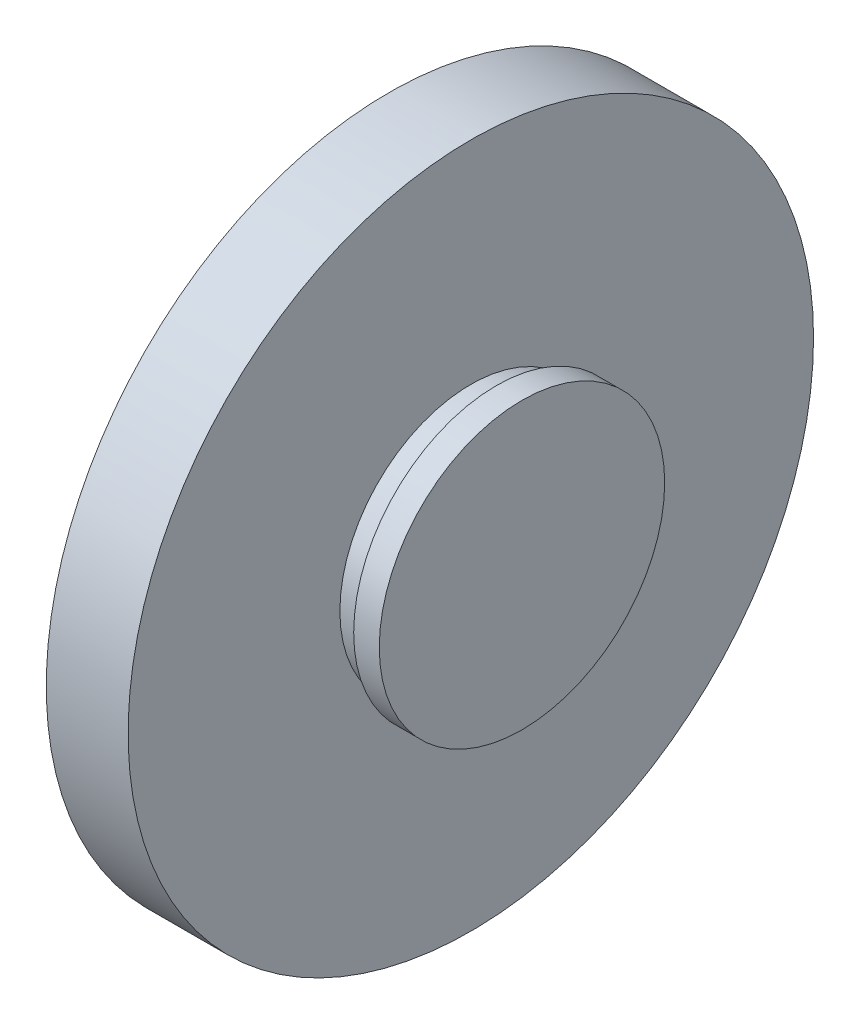
ISO-10303-21;
HEADER;
FILE_DESCRIPTION(('STEP AP214'),'2;1');
FILE_NAME('part.step','',(''),(''),'','','');
FILE_SCHEMA(('AUTOMOTIVE_DESIGN { 1 0 10303 214 1 1 1 1 }'));
ENDSEC;
DATA;
#1=APPLICATION_CONTEXT('core data for automotive mechanical design processes');
#2=APPLICATION_PROTOCOL_DEFINITION('international standard','automotive_design',2000,#1);
#3=PRODUCT_CONTEXT('',#1,'mechanical');
#4=PRODUCT('Part','Part','',(#3));
#5=PRODUCT_RELATED_PRODUCT_CATEGORY('part','',(#4));
#6=PRODUCT_DEFINITION_FORMATION('','',#4);
#7=PRODUCT_DEFINITION_CONTEXT('part definition',#1,'design');
#8=PRODUCT_DEFINITION('design','',#6,#7);
#9=PRODUCT_DEFINITION_SHAPE('','',#8);
#10=(LENGTH_UNIT() NAMED_UNIT(*) SI_UNIT(.MILLI.,.METRE.));
#11=(NAMED_UNIT(*) PLANE_ANGLE_UNIT() SI_UNIT($,.RADIAN.));
#12=(NAMED_UNIT(*) SI_UNIT($,.STERADIAN.) SOLID_ANGLE_UNIT());
#13=UNCERTAINTY_MEASURE_WITH_UNIT(LENGTH_MEASURE(1.E-05),#10,'distance_accuracy_value','');
#14=(GEOMETRIC_REPRESENTATION_CONTEXT(3) GLOBAL_UNCERTAINTY_ASSIGNED_CONTEXT((#13)) GLOBAL_UNIT_ASSIGNED_CONTEXT((#10,
#11,#12)) REPRESENTATION_CONTEXT('',''));
#15=CARTESIAN_POINT('',(0.,0.,0.));
#16=DIRECTION('',(0.,0.,1.));
#17=DIRECTION('',(1.,0.,0.));
#18=AXIS2_PLACEMENT_3D('',#15,#16,#17);
#19=CARTESIAN_POINT('',(8.,0.,0.));
#20=DIRECTION('',(-1.,0.,0.));
#21=DIRECTION('',(0.,0.,1.));
#22=AXIS2_PLACEMENT_3D('',#19,#20,#21);
#23=CYLINDRICAL_SURFACE('',#22,33.5);
#24=CARTESIAN_POINT('',(8.,0.,0.));
#25=DIRECTION('',(1.,0.,0.));
#26=DIRECTION('',(0.,0.,-1.));
#27=AXIS2_PLACEMENT_3D('',#24,#25,#26);
#28=CIRCLE('',#27,33.5);
#29=CARTESIAN_POINT('',(8.,0.,-33.5));
#30=VERTEX_POINT('',#29);
#31=EDGE_CURVE('E45',#30,#30,#28,.T.);
#32=ORIENTED_EDGE('',*,*,#31,.F.);
#33=EDGE_LOOP('',(#32));
#34=FACE_BOUND('',#33,.T.);
#35=CARTESIAN_POINT('',(0.,0.,0.));
#36=DIRECTION('',(1.,0.,0.));
#37=DIRECTION('',(0.,0.,-1.));
#38=AXIS2_PLACEMENT_3D('',#35,#36,#37);
#39=CIRCLE('',#38,33.5);
#40=CARTESIAN_POINT('',(0.,0.,-33.5));
#41=VERTEX_POINT('',#40);
#42=EDGE_CURVE('E40',#41,#41,#39,.T.);
#43=ORIENTED_EDGE('',*,*,#42,.T.);
#44=EDGE_LOOP('',(#43));
#45=FACE_BOUND('',#44,.T.);
#46=ADVANCED_FACE('F37',(#34,#45),#23,.T.);
#47=CARTESIAN_POINT('',(8.,0.,0.));
#48=DIRECTION('',(1.,0.,0.));
#49=DIRECTION('',(0.,0.,-1.));
#50=AXIS2_PLACEMENT_3D('',#47,#48,#49);
#51=PLANE('',#50);
#52=CARTESIAN_POINT('',(8.,0.,0.));
#53=DIRECTION('',(1.,0.,0.));
#54=DIRECTION('',(0.,0.,-1.));
#55=AXIS2_PLACEMENT_3D('',#52,#53,#54);
#56=CIRCLE('',#55,12.8);
#57=CARTESIAN_POINT('',(8.,0.,-12.8));
#58=VERTEX_POINT('',#57);
#59=EDGE_CURVE('E11',#58,#58,#56,.T.);
#60=ORIENTED_EDGE('',*,*,#59,.F.);
#61=EDGE_LOOP('',(#60));
#62=FACE_BOUND('',#61,.T.);
#63=ORIENTED_EDGE('',*,*,#31,.T.);
#64=EDGE_LOOP('',(#63));
#65=FACE_BOUND('',#64,.T.);
#66=ADVANCED_FACE('F230',(#62,#65),#51,.T.);
#67=CARTESIAN_POINT('',(0.,0.,0.));
#68=DIRECTION('',(1.,0.,0.));
#69=DIRECTION('',(0.,0.,-1.));
#70=AXIS2_PLACEMENT_3D('',#67,#68,#69);
#71=PLANE('',#70);
#72=DIRECTION('',(0.,-0.119879149923698,0.992788491781392));
#73=VECTOR('',#72,1.);
#74=CARTESIAN_POINT('',(0.,-6.5,-6.5));
#75=LINE('',#74,#73);
#76=CARTESIAN_POINT('',(0.,-4.00000000000001,-27.2039441890706));
#77=VERTEX_POINT('',#76);
#78=CARTESIAN_POINT('',(0.,-6.5,-6.5));
#79=VERTEX_POINT('',#78);
#80=EDGE_CURVE('E163',#77,#79,#75,.T.);
#81=ORIENTED_EDGE('',*,*,#80,.F.);
#82=CARTESIAN_POINT('',(0.,0.,-26.7209444326629));
#83=DIRECTION('',(-1.,0.,0.));
#84=DIRECTION('',(0.,0.,1.));
#85=AXIS2_PLACEMENT_3D('',#82,#83,#84);
#86=CIRCLE('',#85,4.02905556733709);
#87=CARTESIAN_POINT('',(0.,4.00000000000002,-27.2039441890706));
#88=VERTEX_POINT('',#87);
#89=EDGE_CURVE('E53',#88,#77,#86,.T.);
#90=ORIENTED_EDGE('',*,*,#89,.F.);
#91=DIRECTION('',(0.,-0.119879149923698,-0.992788491781392));
#92=VECTOR('',#91,1.);
#93=CARTESIAN_POINT('',(0.,4.00000000000002,-27.2039441890706));
#94=LINE('',#93,#92);
#95=CARTESIAN_POINT('',(0.,6.5,-6.5));
#96=VERTEX_POINT('',#95);
#97=EDGE_CURVE('E191',#96,#88,#94,.T.);
#98=ORIENTED_EDGE('',*,*,#97,.F.);
#99=DIRECTION('',(0.,-0.992788491781392,-0.119879149923698));
#100=VECTOR('',#99,1.);
#101=CARTESIAN_POINT('',(0.,6.5,-6.5));
#102=LINE('',#101,#100);
#103=CARTESIAN_POINT('',(0.,27.2039441890706,-4.));
#104=VERTEX_POINT('',#103);
#105=EDGE_CURVE('E189',#104,#96,#102,.T.);
#106=ORIENTED_EDGE('',*,*,#105,.F.);
#107=CARTESIAN_POINT('',(0.,26.7209444326629,0.));
#108=DIRECTION('',(-1.,0.,0.));
#109=DIRECTION('',(0.,0.,-1.));
#110=AXIS2_PLACEMENT_3D('',#107,#108,#109);
#111=CIRCLE('',#110,4.02905556733708);
#112=CARTESIAN_POINT('',(0.,27.2039441890706,4.));
#113=VERTEX_POINT('',#112);
#114=EDGE_CURVE('E137',#113,#104,#111,.T.);
#115=ORIENTED_EDGE('',*,*,#114,.F.);
#116=DIRECTION('',(0.,0.992788491781392,-0.119879149923698));
#117=VECTOR('',#116,1.);
#118=CARTESIAN_POINT('',(0.,27.2039441890706,4.));
#119=LINE('',#118,#117);
#120=CARTESIAN_POINT('',(0.,6.5,6.5));
#121=VERTEX_POINT('',#120);
#122=EDGE_CURVE('E185',#121,#113,#119,.T.);
#123=ORIENTED_EDGE('',*,*,#122,.F.);
#124=DIRECTION('',(0.,0.119879149923698,-0.992788491781392));
#125=VECTOR('',#124,1.);
#126=CARTESIAN_POINT('',(0.,6.5,6.5));
#127=LINE('',#126,#125);
#128=CARTESIAN_POINT('',(0.,4.00000000000002,27.2039441890706));
#129=VERTEX_POINT('',#128);
#130=EDGE_CURVE('E182',#129,#121,#127,.T.);
#131=ORIENTED_EDGE('',*,*,#130,.F.);
#132=CARTESIAN_POINT('',(0.,0.,26.7209444326629));
#133=DIRECTION('',(-1.,0.,0.));
#134=DIRECTION('',(0.,0.,-1.));
#135=AXIS2_PLACEMENT_3D('',#132,#133,#134);
#136=CIRCLE('',#135,4.02905556733709);
#137=CARTESIAN_POINT('',(0.,-4.00000000000002,27.2039441890706));
#138=VERTEX_POINT('',#137);
#139=EDGE_CURVE('E179',#138,#129,#136,.T.);
#140=ORIENTED_EDGE('',*,*,#139,.F.);
#141=DIRECTION('',(0.,0.119879149923698,0.992788491781392));
#142=VECTOR('',#141,1.);
#143=CARTESIAN_POINT('',(0.,-4.00000000000002,27.2039441890706));
#144=LINE('',#143,#142);
#145=CARTESIAN_POINT('',(0.,-6.5,6.5));
#146=VERTEX_POINT('',#145);
#147=EDGE_CURVE('E176',#146,#138,#144,.T.);
#148=ORIENTED_EDGE('',*,*,#147,.F.);
#149=DIRECTION('',(0.,0.992788491781392,0.119879149923698));
#150=VECTOR('',#149,1.);
#151=CARTESIAN_POINT('',(0.,-6.5,6.5));
#152=LINE('',#151,#150);
#153=CARTESIAN_POINT('',(0.,-27.2039441890706,4.));
#154=VERTEX_POINT('',#153);
#155=EDGE_CURVE('E173',#154,#146,#152,.T.);
#156=ORIENTED_EDGE('',*,*,#155,.F.);
#157=CARTESIAN_POINT('',(0.,-26.7209444326629,0.));
#158=DIRECTION('',(-1.,0.,0.));
#159=DIRECTION('',(0.,0.,-1.));
#160=AXIS2_PLACEMENT_3D('',#157,#158,#159);
#161=CIRCLE('',#160,4.02905556733708);
#162=CARTESIAN_POINT('',(0.,-27.2039441890706,-4.));
#163=VERTEX_POINT('',#162);
#164=EDGE_CURVE('E170',#163,#154,#161,.T.);
#165=ORIENTED_EDGE('',*,*,#164,.F.);
#166=DIRECTION('',(0.,-0.992788491781392,0.119879149923698));
#167=VECTOR('',#166,1.);
#168=CARTESIAN_POINT('',(0.,-27.2039441890706,-4.));
#169=LINE('',#168,#167);
#170=EDGE_CURVE('E167',#79,#163,#169,.T.);
#171=ORIENTED_EDGE('',*,*,#170,.F.);
#172=EDGE_LOOP('',(#81,#90,#98,#106,#115,#123,#131,#140,#148,#156,#165,#171));
#173=FACE_BOUND('',#172,.T.);
#174=ORIENTED_EDGE('',*,*,#42,.F.);
#175=EDGE_LOOP('',(#174));
#176=FACE_BOUND('',#175,.T.);
#177=ADVANCED_FACE('F227',(#173,#176),#71,.F.);
#178=CARTESIAN_POINT('',(10.5,0.,0.));
#179=DIRECTION('',(-1.,0.,0.));
#180=DIRECTION('',(0.,0.,1.));
#181=AXIS2_PLACEMENT_3D('',#178,#179,#180);
#182=CYLINDRICAL_SURFACE('',#181,12.8);
#183=CARTESIAN_POINT('',(10.5,0.,0.));
#184=DIRECTION('',(1.,0.,0.));
#185=DIRECTION('',(0.,0.,-1.));
#186=AXIS2_PLACEMENT_3D('',#183,#184,#185);
#187=CIRCLE('',#186,12.8);
#188=CARTESIAN_POINT('',(10.5,0.,-12.8));
#189=VERTEX_POINT('',#188);
#190=EDGE_CURVE('E216',#189,#189,#187,.T.);
#191=ORIENTED_EDGE('',*,*,#190,.F.);
#192=EDGE_LOOP('',(#191));
#193=FACE_BOUND('',#192,.T.);
#194=ORIENTED_EDGE('',*,*,#59,.T.);
#195=EDGE_LOOP('',(#194));
#196=FACE_BOUND('',#195,.T.);
#197=ADVANCED_FACE('F229',(#193,#196),#182,.T.);
#198=CARTESIAN_POINT('',(13.,0.,0.));
#199=DIRECTION('',(-1.,0.,0.));
#200=DIRECTION('',(0.,0.,1.));
#201=AXIS2_PLACEMENT_3D('',#198,#199,#200);
#202=CYLINDRICAL_SURFACE('',#201,13.95);
#203=CARTESIAN_POINT('',(13.,0.,0.));
#204=DIRECTION('',(1.,0.,0.));
#205=DIRECTION('',(0.,0.,-1.));
#206=AXIS2_PLACEMENT_3D('',#203,#204,#205);
#207=CIRCLE('',#206,13.95);
#208=CARTESIAN_POINT('',(13.,0.,-13.95));
#209=VERTEX_POINT('',#208);
#210=EDGE_CURVE('E213',#209,#209,#207,.T.);
#211=ORIENTED_EDGE('',*,*,#210,.F.);
#212=EDGE_LOOP('',(#211));
#213=FACE_BOUND('',#212,.T.);
#214=CARTESIAN_POINT('',(10.5,0.,0.));
#215=DIRECTION('',(1.,0.,0.));
#216=DIRECTION('',(0.,0.,-1.));
#217=AXIS2_PLACEMENT_3D('',#214,#215,#216);
#218=CIRCLE('',#217,13.95);
#219=CARTESIAN_POINT('',(10.5,0.,-13.95));
#220=VERTEX_POINT('',#219);
#221=EDGE_CURVE('E195',#220,#220,#218,.T.);
#222=ORIENTED_EDGE('',*,*,#221,.T.);
#223=EDGE_LOOP('',(#222));
#224=FACE_BOUND('',#223,.T.);
#225=ADVANCED_FACE('F236',(#213,#224),#202,.T.);
#226=CARTESIAN_POINT('',(13.,0.,0.));
#227=DIRECTION('',(1.,0.,0.));
#228=DIRECTION('',(0.,0.,-1.));
#229=AXIS2_PLACEMENT_3D('',#226,#227,#228);
#230=PLANE('',#229);
#231=ORIENTED_EDGE('',*,*,#210,.T.);
#232=EDGE_LOOP('',(#231));
#233=FACE_BOUND('',#232,.T.);
#234=ADVANCED_FACE('F266',(#233),#230,.T.);
#235=CARTESIAN_POINT('',(10.5,0.,0.));
#236=DIRECTION('',(1.,0.,0.));
#237=DIRECTION('',(0.,0.,-1.));
#238=AXIS2_PLACEMENT_3D('',#235,#236,#237);
#239=PLANE('',#238);
#240=ORIENTED_EDGE('',*,*,#190,.T.);
#241=EDGE_LOOP('',(#240));
#242=FACE_BOUND('',#241,.T.);
#243=ORIENTED_EDGE('',*,*,#221,.F.);
#244=EDGE_LOOP('',(#243));
#245=FACE_BOUND('',#244,.T.);
#246=ADVANCED_FACE('F276',(#242,#245),#239,.F.);
#247=CARTESIAN_POINT('',(5.5,0.,-26.7209444326629));
#248=DIRECTION('',(-1.,0.,0.));
#249=DIRECTION('',(0.,0.,1.));
#250=AXIS2_PLACEMENT_3D('',#247,#248,#249);
#251=CYLINDRICAL_SURFACE('',#250,4.02905556733709);
#252=ORIENTED_EDGE('',*,*,#89,.T.);
#253=DIRECTION('',(-1.,0.,0.));
#254=VECTOR('',#253,1.);
#255=CARTESIAN_POINT('',(5.5,-4.00000000000002,-27.2039441890706));
#256=LINE('',#255,#254);
#257=CARTESIAN_POINT('',(5.5,-4.00000000000002,-27.2039441890706));
#258=VERTEX_POINT('',#257);
#259=EDGE_CURVE('E101',#258,#77,#256,.T.);
#260=ORIENTED_EDGE('',*,*,#259,.F.);
#261=CARTESIAN_POINT('',(5.5,0.,-26.7209444326629));
#262=DIRECTION('',(-1.,0.,0.));
#263=DIRECTION('',(0.,0.,1.));
#264=AXIS2_PLACEMENT_3D('',#261,#262,#263);
#265=CIRCLE('',#264,4.02905556733709);
#266=CARTESIAN_POINT('',(5.5,4.00000000000002,-27.2039441890706));
#267=VERTEX_POINT('',#266);
#268=EDGE_CURVE('E193',#267,#258,#265,.T.);
#269=ORIENTED_EDGE('',*,*,#268,.F.);
#270=DIRECTION('',(-1.,0.,0.));
#271=VECTOR('',#270,1.);
#272=CARTESIAN_POINT('',(5.5,4.00000000000002,-27.2039441890706));
#273=LINE('',#272,#271);
#274=EDGE_CURVE('E61',#267,#88,#273,.T.);
#275=ORIENTED_EDGE('',*,*,#274,.T.);
#276=EDGE_LOOP('',(#252,#260,#269,#275));
#277=FACE_BOUND('',#276,.T.);
#278=ADVANCED_FACE('F285',(#277),#251,.F.);
#279=CARTESIAN_POINT('',(5.5,4.00000000000002,-27.2039441890706));
#280=DIRECTION('',(0.,0.992788491781392,-0.119879149923698));
#281=DIRECTION('',(0.,0.119879149923698,0.992788491781392));
#282=AXIS2_PLACEMENT_3D('',#279,#280,#281);
#283=PLANE('',#282);
#284=ORIENTED_EDGE('',*,*,#97,.T.);
#285=ORIENTED_EDGE('',*,*,#274,.F.);
#286=DIRECTION('',(0.,-0.119879149923698,-0.992788491781392));
#287=VECTOR('',#286,1.);
#288=CARTESIAN_POINT('',(5.5,4.00000000000002,-27.2039441890706));
#289=LINE('',#288,#287);
#290=CARTESIAN_POINT('',(5.5,6.5,-6.5));
#291=VERTEX_POINT('',#290);
#292=EDGE_CURVE('E149',#291,#267,#289,.T.);
#293=ORIENTED_EDGE('',*,*,#292,.F.);
#294=DIRECTION('',(-1.,0.,0.));
#295=VECTOR('',#294,1.);
#296=CARTESIAN_POINT('',(5.5,6.5,-6.5));
#297=LINE('',#296,#295);
#298=EDGE_CURVE('E141',#291,#96,#297,.T.);
#299=ORIENTED_EDGE('',*,*,#298,.T.);
#300=EDGE_LOOP('',(#284,#285,#293,#299));
#301=FACE_BOUND('',#300,.T.);
#302=ADVANCED_FACE('F299',(#301),#283,.F.);
#303=CARTESIAN_POINT('',(5.5,6.5,-6.5));
#304=DIRECTION('',(0.,0.119879149923698,-0.992788491781392));
#305=DIRECTION('',(0.,0.992788491781392,0.119879149923698));
#306=AXIS2_PLACEMENT_3D('',#303,#304,#305);
#307=PLANE('',#306);
#308=ORIENTED_EDGE('',*,*,#105,.T.);
#309=ORIENTED_EDGE('',*,*,#298,.F.);
#310=DIRECTION('',(0.,-0.992788491781392,-0.119879149923698));
#311=VECTOR('',#310,1.);
#312=CARTESIAN_POINT('',(5.5,6.5,-6.5));
#313=LINE('',#312,#311);
#314=CARTESIAN_POINT('',(5.5,27.2039441890706,-4.));
#315=VERTEX_POINT('',#314);
#316=EDGE_CURVE('E145',#315,#291,#313,.T.);
#317=ORIENTED_EDGE('',*,*,#316,.F.);
#318=DIRECTION('',(-1.,0.,0.));
#319=VECTOR('',#318,1.);
#320=CARTESIAN_POINT('',(5.5,27.2039441890706,-4.));
#321=LINE('',#320,#319);
#322=EDGE_CURVE('E130',#315,#104,#321,.T.);
#323=ORIENTED_EDGE('',*,*,#322,.T.);
#324=EDGE_LOOP('',(#308,#309,#317,#323));
#325=FACE_BOUND('',#324,.T.);
#326=ADVANCED_FACE('F146',(#325),#307,.F.);
#327=CARTESIAN_POINT('',(5.5,26.7209444326629,0.));
#328=DIRECTION('',(-1.,0.,0.));
#329=DIRECTION('',(0.,0.,1.));
#330=AXIS2_PLACEMENT_3D('',#327,#328,#329);
#331=CYLINDRICAL_SURFACE('',#330,4.02905556733708);
#332=ORIENTED_EDGE('',*,*,#114,.T.);
#333=ORIENTED_EDGE('',*,*,#322,.F.);
#334=CARTESIAN_POINT('',(5.5,26.7209444326629,0.));
#335=DIRECTION('',(-1.,0.,0.));
#336=DIRECTION('',(0.,0.,-1.));
#337=AXIS2_PLACEMENT_3D('',#334,#335,#336);
#338=CIRCLE('',#337,4.02905556733708);
#339=CARTESIAN_POINT('',(5.5,27.2039441890706,4.));
#340=VERTEX_POINT('',#339);
#341=EDGE_CURVE('E134',#340,#315,#338,.T.);
#342=ORIENTED_EDGE('',*,*,#341,.F.);
#343=DIRECTION('',(-1.,0.,0.));
#344=VECTOR('',#343,1.);
#345=CARTESIAN_POINT('',(5.5,27.2039441890706,4.));
#346=LINE('',#345,#344);
#347=EDGE_CURVE('E142',#340,#113,#346,.T.);
#348=ORIENTED_EDGE('',*,*,#347,.T.);
#349=EDGE_LOOP('',(#332,#333,#342,#348));
#350=FACE_BOUND('',#349,.T.);
#351=ADVANCED_FACE('F132',(#350),#331,.F.);
#352=CARTESIAN_POINT('',(5.5,27.2039441890706,4.));
#353=DIRECTION('',(0.,0.119879149923698,0.992788491781392));
#354=DIRECTION('',(0.,-0.992788491781392,0.119879149923698));
#355=AXIS2_PLACEMENT_3D('',#352,#353,#354);
#356=PLANE('',#355);
#357=ORIENTED_EDGE('',*,*,#122,.T.);
#358=ORIENTED_EDGE('',*,*,#347,.F.);
#359=DIRECTION('',(0.,0.992788491781392,-0.119879149923698));
#360=VECTOR('',#359,1.);
#361=CARTESIAN_POINT('',(5.5,27.2039441890706,4.));
#362=LINE('',#361,#360);
#363=CARTESIAN_POINT('',(5.5,6.5,6.5));
#364=VERTEX_POINT('',#363);
#365=EDGE_CURVE('E155',#364,#340,#362,.T.);
#366=ORIENTED_EDGE('',*,*,#365,.F.);
#367=DIRECTION('',(-1.,0.,0.));
#368=VECTOR('',#367,1.);
#369=CARTESIAN_POINT('',(5.5,6.5,6.5));
#370=LINE('',#369,#368);
#371=EDGE_CURVE('E198',#364,#121,#370,.T.);
#372=ORIENTED_EDGE('',*,*,#371,.T.);
#373=EDGE_LOOP('',(#357,#358,#366,#372));
#374=FACE_BOUND('',#373,.T.);
#375=ADVANCED_FACE('F324',(#374),#356,.F.);
#376=CARTESIAN_POINT('',(5.5,6.5,6.5));
#377=DIRECTION('',(0.,0.992788491781392,0.119879149923698));
#378=DIRECTION('',(0.,-0.119879149923698,0.992788491781392));
#379=AXIS2_PLACEMENT_3D('',#376,#377,#378);
#380=PLANE('',#379);
#381=ORIENTED_EDGE('',*,*,#130,.T.);
#382=ORIENTED_EDGE('',*,*,#371,.F.);
#383=DIRECTION('',(0.,0.119879149923698,-0.992788491781392));
#384=VECTOR('',#383,1.);
#385=CARTESIAN_POINT('',(5.5,6.5,6.5));
#386=LINE('',#385,#384);
#387=CARTESIAN_POINT('',(5.5,4.00000000000002,27.2039441890706));
#388=VERTEX_POINT('',#387);
#389=EDGE_CURVE('E157',#388,#364,#386,.T.);
#390=ORIENTED_EDGE('',*,*,#389,.F.);
#391=DIRECTION('',(-1.,0.,0.));
#392=VECTOR('',#391,1.);
#393=CARTESIAN_POINT('',(5.5,4.00000000000002,27.2039441890706));
#394=LINE('',#393,#392);
#395=EDGE_CURVE('E200',#388,#129,#394,.T.);
#396=ORIENTED_EDGE('',*,*,#395,.T.);
#397=EDGE_LOOP('',(#381,#382,#390,#396));
#398=FACE_BOUND('',#397,.T.);
#399=ADVANCED_FACE('F333',(#398),#380,.F.);
#400=CARTESIAN_POINT('',(5.5,0.,26.7209444326629));
#401=DIRECTION('',(-1.,0.,0.));
#402=DIRECTION('',(0.,0.,1.));
#403=AXIS2_PLACEMENT_3D('',#400,#401,#402);
#404=CYLINDRICAL_SURFACE('',#403,4.02905556733709);
#405=ORIENTED_EDGE('',*,*,#139,.T.);
#406=ORIENTED_EDGE('',*,*,#395,.F.);
#407=CARTESIAN_POINT('',(5.5,0.,26.7209444326629));
#408=DIRECTION('',(-1.,0.,0.));
#409=DIRECTION('',(0.,0.,-1.));
#410=AXIS2_PLACEMENT_3D('',#407,#408,#409);
#411=CIRCLE('',#410,4.02905556733709);
#412=CARTESIAN_POINT('',(5.5,-4.00000000000002,27.2039441890706));
#413=VERTEX_POINT('',#412);
#414=EDGE_CURVE('E459',#413,#388,#411,.T.);
#415=ORIENTED_EDGE('',*,*,#414,.F.);
#416=DIRECTION('',(-1.,0.,0.));
#417=VECTOR('',#416,1.);
#418=CARTESIAN_POINT('',(5.5,-4.00000000000002,27.2039441890706));
#419=LINE('',#418,#417);
#420=EDGE_CURVE('E202',#413,#138,#419,.T.);
#421=ORIENTED_EDGE('',*,*,#420,.T.);
#422=EDGE_LOOP('',(#405,#406,#415,#421));
#423=FACE_BOUND('',#422,.T.);
#424=ADVANCED_FACE('F343',(#423),#404,.F.);
#425=CARTESIAN_POINT('',(5.5,-4.00000000000002,27.2039441890706));
#426=DIRECTION('',(0.,-0.992788491781392,0.119879149923698));
#427=DIRECTION('',(0.,-0.119879149923698,-0.992788491781392));
#428=AXIS2_PLACEMENT_3D('',#425,#426,#427);
#429=PLANE('',#428);
#430=ORIENTED_EDGE('',*,*,#147,.T.);
#431=ORIENTED_EDGE('',*,*,#420,.F.);
#432=DIRECTION('',(0.,0.119879149923698,0.992788491781392));
#433=VECTOR('',#432,1.);
#434=CARTESIAN_POINT('',(5.5,-4.00000000000002,27.2039441890706));
#435=LINE('',#434,#433);
#436=CARTESIAN_POINT('',(5.5,-6.5,6.5));
#437=VERTEX_POINT('',#436);
#438=EDGE_CURVE('E456',#437,#413,#435,.T.);
#439=ORIENTED_EDGE('',*,*,#438,.F.);
#440=DIRECTION('',(-1.,0.,0.));
#441=VECTOR('',#440,1.);
#442=CARTESIAN_POINT('',(5.5,-6.5,6.5));
#443=LINE('',#442,#441);
#444=EDGE_CURVE('E204',#437,#146,#443,.T.);
#445=ORIENTED_EDGE('',*,*,#444,.T.);
#446=EDGE_LOOP('',(#430,#431,#439,#445));
#447=FACE_BOUND('',#446,.T.);
#448=ADVANCED_FACE('F353',(#447),#429,.F.);
#449=CARTESIAN_POINT('',(5.5,-6.5,6.5));
#450=DIRECTION('',(0.,-0.119879149923698,0.992788491781392));
#451=DIRECTION('',(0.,-0.992788491781392,-0.119879149923698));
#452=AXIS2_PLACEMENT_3D('',#449,#450,#451);
#453=PLANE('',#452);
#454=ORIENTED_EDGE('',*,*,#155,.T.);
#455=ORIENTED_EDGE('',*,*,#444,.F.);
#456=DIRECTION('',(0.,0.992788491781392,0.119879149923698));
#457=VECTOR('',#456,1.);
#458=CARTESIAN_POINT('',(5.5,-6.5,6.5));
#459=LINE('',#458,#457);
#460=CARTESIAN_POINT('',(5.5,-27.2039441890706,4.));
#461=VERTEX_POINT('',#460);
#462=EDGE_CURVE('E453',#461,#437,#459,.T.);
#463=ORIENTED_EDGE('',*,*,#462,.F.);
#464=DIRECTION('',(-1.,0.,0.));
#465=VECTOR('',#464,1.);
#466=CARTESIAN_POINT('',(5.5,-27.2039441890706,4.));
#467=LINE('',#466,#465);
#468=EDGE_CURVE('E206',#461,#154,#467,.T.);
#469=ORIENTED_EDGE('',*,*,#468,.T.);
#470=EDGE_LOOP('',(#454,#455,#463,#469));
#471=FACE_BOUND('',#470,.T.);
#472=ADVANCED_FACE('F363',(#471),#453,.F.);
#473=CARTESIAN_POINT('',(5.5,-26.7209444326629,0.));
#474=DIRECTION('',(-1.,0.,0.));
#475=DIRECTION('',(0.,0.,1.));
#476=AXIS2_PLACEMENT_3D('',#473,#474,#475);
#477=CYLINDRICAL_SURFACE('',#476,4.02905556733708);
#478=ORIENTED_EDGE('',*,*,#164,.T.);
#479=ORIENTED_EDGE('',*,*,#468,.F.);
#480=CARTESIAN_POINT('',(5.5,-26.7209444326629,0.));
#481=DIRECTION('',(-1.,0.,0.));
#482=DIRECTION('',(0.,0.,-1.));
#483=AXIS2_PLACEMENT_3D('',#480,#481,#482);
#484=CIRCLE('',#483,4.02905556733708);
#485=CARTESIAN_POINT('',(5.5,-27.2039441890706,-4.));
#486=VERTEX_POINT('',#485);
#487=EDGE_CURVE('E450',#486,#461,#484,.T.);
#488=ORIENTED_EDGE('',*,*,#487,.F.);
#489=DIRECTION('',(-1.,0.,0.));
#490=VECTOR('',#489,1.);
#491=CARTESIAN_POINT('',(5.5,-27.2039441890706,-4.));
#492=LINE('',#491,#490);
#493=EDGE_CURVE('E208',#486,#163,#492,.T.);
#494=ORIENTED_EDGE('',*,*,#493,.T.);
#495=EDGE_LOOP('',(#478,#479,#488,#494));
#496=FACE_BOUND('',#495,.T.);
#497=ADVANCED_FACE('F373',(#496),#477,.F.);
#498=CARTESIAN_POINT('',(5.5,-27.2039441890706,-4.));
#499=DIRECTION('',(0.,-0.119879149923698,-0.992788491781392));
#500=DIRECTION('',(0.,0.992788491781392,-0.119879149923698));
#501=AXIS2_PLACEMENT_3D('',#498,#499,#500);
#502=PLANE('',#501);
#503=ORIENTED_EDGE('',*,*,#170,.T.);
#504=ORIENTED_EDGE('',*,*,#493,.F.);
#505=DIRECTION('',(0.,-0.992788491781392,0.119879149923698));
#506=VECTOR('',#505,1.);
#507=CARTESIAN_POINT('',(5.5,-27.2039441890706,-4.));
#508=LINE('',#507,#506);
#509=CARTESIAN_POINT('',(5.5,-6.5,-6.5));
#510=VERTEX_POINT('',#509);
#511=EDGE_CURVE('E447',#510,#486,#508,.T.);
#512=ORIENTED_EDGE('',*,*,#511,.F.);
#513=DIRECTION('',(-1.,0.,0.));
#514=VECTOR('',#513,1.);
#515=CARTESIAN_POINT('',(5.5,-6.5,-6.5));
#516=LINE('',#515,#514);
#517=EDGE_CURVE('E210',#510,#79,#516,.T.);
#518=ORIENTED_EDGE('',*,*,#517,.T.);
#519=EDGE_LOOP('',(#503,#504,#512,#518));
#520=FACE_BOUND('',#519,.T.);
#521=ADVANCED_FACE('F383',(#520),#502,.F.);
#522=CARTESIAN_POINT('',(5.5,-6.5,-6.5));
#523=DIRECTION('',(0.,-0.992788491781392,-0.119879149923698));
#524=DIRECTION('',(0.,0.119879149923698,-0.992788491781392));
#525=AXIS2_PLACEMENT_3D('',#522,#523,#524);
#526=PLANE('',#525);
#527=ORIENTED_EDGE('',*,*,#80,.T.);
#528=ORIENTED_EDGE('',*,*,#517,.F.);
#529=DIRECTION('',(0.,-0.119879149923698,0.992788491781392));
#530=VECTOR('',#529,1.);
#531=CARTESIAN_POINT('',(5.5,-6.5,-6.5));
#532=LINE('',#531,#530);
#533=EDGE_CURVE('E444',#258,#510,#532,.T.);
#534=ORIENTED_EDGE('',*,*,#533,.F.);
#535=ORIENTED_EDGE('',*,*,#259,.T.);
#536=EDGE_LOOP('',(#527,#528,#534,#535));
#537=FACE_BOUND('',#536,.T.);
#538=ADVANCED_FACE('F393',(#537),#526,.F.);
#539=CARTESIAN_POINT('',(5.5,0.,-26.7209444326629));
#540=DIRECTION('',(-1.,0.,0.));
#541=DIRECTION('',(0.,0.,1.));
#542=AXIS2_PLACEMENT_3D('',#539,#540,#541);
#543=PLANE('',#542);
#544=CARTESIAN_POINT('',(5.5,0.,0.));
#545=DIRECTION('',(-1.,0.,0.));
#546=DIRECTION('',(0.,0.,1.));
#547=AXIS2_PLACEMENT_3D('',#544,#545,#546);
#548=CIRCLE('',#547,6.);
#549=CARTESIAN_POINT('',(5.5,0.,6.));
#550=VERTEX_POINT('',#549);
#551=EDGE_CURVE('E438',#550,#550,#548,.T.);
#552=ORIENTED_EDGE('',*,*,#551,.F.);
#553=EDGE_LOOP('',(#552));
#554=FACE_BOUND('',#553,.T.);
#555=ORIENTED_EDGE('',*,*,#268,.T.);
#556=ORIENTED_EDGE('',*,*,#533,.T.);
#557=ORIENTED_EDGE('',*,*,#511,.T.);
#558=ORIENTED_EDGE('',*,*,#487,.T.);
#559=ORIENTED_EDGE('',*,*,#462,.T.);
#560=ORIENTED_EDGE('',*,*,#438,.T.);
#561=ORIENTED_EDGE('',*,*,#414,.T.);
#562=ORIENTED_EDGE('',*,*,#389,.T.);
#563=ORIENTED_EDGE('',*,*,#365,.T.);
#564=ORIENTED_EDGE('',*,*,#341,.T.);
#565=ORIENTED_EDGE('',*,*,#316,.T.);
#566=ORIENTED_EDGE('',*,*,#292,.T.);
#567=EDGE_LOOP('',(#555,#556,#557,#558,#559,#560,#561,#562,#563,#564,#565,#566));
#568=FACE_BOUND('',#567,.T.);
#569=ADVANCED_FACE('F152',(#554,#568),#543,.T.);
#570=CARTESIAN_POINT('',(8.7,0.,0.));
#571=DIRECTION('',(-1.,0.,0.));
#572=DIRECTION('',(0.,0.,1.));
#573=AXIS2_PLACEMENT_3D('',#570,#571,#572);
#574=CYLINDRICAL_SURFACE('',#573,6.);
#575=CARTESIAN_POINT('',(8.7,0.,0.));
#576=DIRECTION('',(-1.,0.,0.));
#577=DIRECTION('',(0.,0.,1.));
#578=AXIS2_PLACEMENT_3D('',#575,#576,#577);
#579=CIRCLE('',#578,6.);
#580=CARTESIAN_POINT('',(8.7,0.,6.));
#581=VERTEX_POINT('',#580);
#582=EDGE_CURVE('E164',#581,#581,#579,.T.);
#583=ORIENTED_EDGE('',*,*,#582,.F.);
#584=EDGE_LOOP('',(#583));
#585=FACE_BOUND('',#584,.T.);
#586=ORIENTED_EDGE('',*,*,#551,.T.);
#587=EDGE_LOOP('',(#586));
#588=FACE_BOUND('',#587,.T.);
#589=ADVANCED_FACE('F412',(#585,#588),#574,.F.);
#590=CARTESIAN_POINT('',(8.7,0.,0.));
#591=DIRECTION('',(-1.,0.,0.));
#592=DIRECTION('',(0.,0.,1.));
#593=AXIS2_PLACEMENT_3D('',#590,#591,#592);
#594=PLANE('',#593);
#595=ORIENTED_EDGE('',*,*,#582,.T.);
#596=EDGE_LOOP('',(#595));
#597=FACE_BOUND('',#596,.T.);
#598=ADVANCED_FACE('F422',(#597),#594,.T.);
#599=CLOSED_SHELL('',(#46,#66,#177,#197,#225,#234,#246,#278,#302,#326,#351,#375,#399,#424,#448,
#472,#497,#521,#538,#569,#589,#598));
#600=MANIFOLD_SOLID_BREP('B2',#599);
#601=ADVANCED_BREP_SHAPE_REPRESENTATION('',(#18,#600),#14);
#602=SHAPE_DEFINITION_REPRESENTATION(#9,#601);
ENDSEC;
END-ISO-10303-21;
